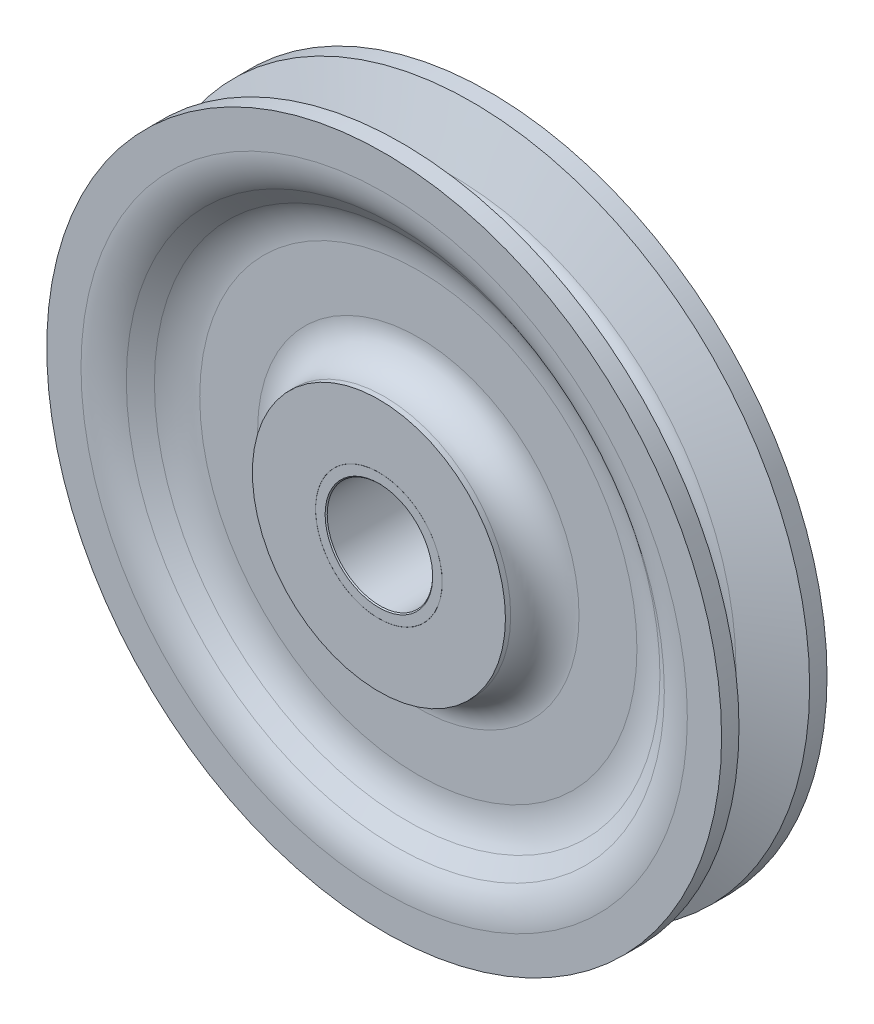
ISO-10303-21;
HEADER;
FILE_DESCRIPTION(('STEP AP214'),'2;1');
FILE_NAME('part.step','',(''),(''),'','','');
FILE_SCHEMA(('AUTOMOTIVE_DESIGN { 1 0 10303 214 1 1 1 1 }'));
ENDSEC;
DATA;
#1=APPLICATION_CONTEXT('core data for automotive mechanical design processes');
#2=APPLICATION_PROTOCOL_DEFINITION('international standard','automotive_design',2000,#1);
#3=PRODUCT_CONTEXT('',#1,'mechanical');
#4=PRODUCT('Part','Part','',(#3));
#5=PRODUCT_RELATED_PRODUCT_CATEGORY('part','',(#4));
#6=PRODUCT_DEFINITION_FORMATION('','',#4);
#7=PRODUCT_DEFINITION_CONTEXT('part definition',#1,'design');
#8=PRODUCT_DEFINITION('design','',#6,#7);
#9=PRODUCT_DEFINITION_SHAPE('','',#8);
#10=(LENGTH_UNIT() NAMED_UNIT(*) SI_UNIT(.MILLI.,.METRE.));
#11=(NAMED_UNIT(*) PLANE_ANGLE_UNIT() SI_UNIT($,.RADIAN.));
#12=(NAMED_UNIT(*) SI_UNIT($,.STERADIAN.) SOLID_ANGLE_UNIT());
#13=UNCERTAINTY_MEASURE_WITH_UNIT(LENGTH_MEASURE(1.E-05),#10,'distance_accuracy_value','');
#14=(GEOMETRIC_REPRESENTATION_CONTEXT(3) GLOBAL_UNCERTAINTY_ASSIGNED_CONTEXT((#13)) GLOBAL_UNIT_ASSIGNED_CONTEXT((#10,
#11,#12)) REPRESENTATION_CONTEXT('',''));
#15=CARTESIAN_POINT('',(0.,0.,0.));
#16=DIRECTION('',(0.,0.,1.));
#17=DIRECTION('',(1.,0.,0.));
#18=AXIS2_PLACEMENT_3D('',#15,#16,#17);
#19=CARTESIAN_POINT('',(0.,0.,0.));
#20=DIRECTION('',(0.,0.,1.));
#21=DIRECTION('',(1.,0.,0.));
#22=AXIS2_PLACEMENT_3D('',#19,#20,#21);
#23=TOROIDAL_SURFACE('',#22,87.3125,4.7625);
#24=CARTESIAN_POINT('',(0.,0.,4.44147333552489));
#25=DIRECTION('',(0.,0.,1.));
#26=DIRECTION('',(1.,0.,0.));
#27=AXIS2_PLACEMENT_3D('',#24,#25,#26);
#28=CIRCLE('',#27,85.5935698502203);
#29=CARTESIAN_POINT('',(85.5935698502203,0.,4.44147333552489));
#30=VERTEX_POINT('',#29);
#31=EDGE_CURVE('E132',#30,#30,#28,.T.);
#32=ORIENTED_EDGE('',*,*,#31,.F.);
#33=EDGE_LOOP('',(#32));
#34=FACE_BOUND('',#33,.T.);
#35=CARTESIAN_POINT('',(0.,0.,-4.44147333552489));
#36=DIRECTION('',(0.,0.,1.));
#37=DIRECTION('',(1.,0.,0.));
#38=AXIS2_PLACEMENT_3D('',#35,#36,#37);
#39=CIRCLE('',#38,85.5935698502204);
#40=CARTESIAN_POINT('',(85.5935698502204,0.,-4.44147333552489));
#41=VERTEX_POINT('',#40);
#42=EDGE_CURVE('E128',#41,#41,#39,.T.);
#43=ORIENTED_EDGE('',*,*,#42,.T.);
#44=EDGE_LOOP('',(#43));
#45=FACE_BOUND('',#44,.T.);
#46=ADVANCED_FACE('F59',(#34,#45),#23,.F.);
#47=CARTESIAN_POINT('',(0.,0.,4.44147333552489));
#48=DIRECTION('',(0.,0.,1.));
#49=DIRECTION('',(1.,0.,0.));
#50=AXIS2_PLACEMENT_3D('',#47,#48,#49);
#51=CONICAL_SURFACE('',#50,85.5935698502203,1.20153117514669);
#52=CARTESIAN_POINT('',(0.,0.,10.63625));
#53=DIRECTION('',(0.,0.,1.));
#54=DIRECTION('',(1.,0.,0.));
#55=AXIS2_PLACEMENT_3D('',#52,#53,#54);
#56=CIRCLE('',#55,101.6);
#57=CARTESIAN_POINT('',(101.6,0.,10.63625));
#58=VERTEX_POINT('',#57);
#59=EDGE_CURVE('E150',#58,#58,#56,.T.);
#60=ORIENTED_EDGE('',*,*,#59,.F.);
#61=EDGE_LOOP('',(#60));
#62=FACE_BOUND('',#61,.T.);
#63=ORIENTED_EDGE('',*,*,#31,.T.);
#64=EDGE_LOOP('',(#63));
#65=FACE_BOUND('',#64,.T.);
#66=ADVANCED_FACE('F159',(#62,#65),#51,.T.);
#67=CARTESIAN_POINT('',(0.,0.,17.4625));
#68=DIRECTION('',(0.,0.,1.));
#69=DIRECTION('',(1.,0.,0.));
#70=AXIS2_PLACEMENT_3D('',#67,#68,#69);
#71=CYLINDRICAL_SURFACE('',#70,101.6);
#72=CARTESIAN_POINT('',(0.,0.,15.875));
#73=DIRECTION('',(0.,0.,1.));
#74=DIRECTION('',(1.,0.,0.));
#75=AXIS2_PLACEMENT_3D('',#72,#73,#74);
#76=CIRCLE('',#75,101.6);
#77=CARTESIAN_POINT('',(101.6,0.,15.875));
#78=VERTEX_POINT('',#77);
#79=EDGE_CURVE('E146',#78,#78,#76,.T.);
#80=ORIENTED_EDGE('',*,*,#79,.F.);
#81=EDGE_LOOP('',(#80));
#82=FACE_BOUND('',#81,.T.);
#83=ORIENTED_EDGE('',*,*,#59,.T.);
#84=EDGE_LOOP('',(#83));
#85=FACE_BOUND('',#84,.T.);
#86=ADVANCED_FACE('F254',(#82,#85),#71,.T.);
#87=CARTESIAN_POINT('',(0.,38.1,15.875));
#88=DIRECTION('',(0.,0.,-1.));
#89=DIRECTION('',(-1.,0.,0.));
#90=AXIS2_PLACEMENT_3D('',#87,#88,#89);
#91=PLANE('',#90);
#92=CARTESIAN_POINT('',(0.,0.,15.875));
#93=DIRECTION('',(0.,0.,-1.));
#94=DIRECTION('',(-1.,0.,0.));
#95=AXIS2_PLACEMENT_3D('',#92,#93,#94);
#96=CIRCLE('',#95,91.2848770431011);
#97=CARTESIAN_POINT('',(-91.2848770431011,0.,15.875));
#98=VERTEX_POINT('',#97);
#99=EDGE_CURVE('E85',#98,#98,#96,.T.);
#100=ORIENTED_EDGE('',*,*,#99,.T.);
#101=EDGE_LOOP('',(#100));
#102=FACE_BOUND('',#101,.T.);
#103=ORIENTED_EDGE('',*,*,#79,.T.);
#104=EDGE_LOOP('',(#103));
#105=FACE_BOUND('',#104,.T.);
#106=ADVANCED_FACE('F258',(#102,#105),#91,.F.);
#107=CARTESIAN_POINT('',(0.,0.,17.4625));
#108=DIRECTION('',(0.,0.,1.));
#109=DIRECTION('',(1.,0.,0.));
#110=AXIS2_PLACEMENT_3D('',#107,#108,#109);
#111=CYLINDRICAL_SURFACE('',#110,38.1);
#112=CARTESIAN_POINT('',(0.,0.,15.875));
#113=DIRECTION('',(0.,0.,-1.));
#114=DIRECTION('',(-1.,0.,0.));
#115=AXIS2_PLACEMENT_3D('',#112,#113,#114);
#116=CIRCLE('',#115,38.1);
#117=CARTESIAN_POINT('',(-38.1,0.,15.875));
#118=VERTEX_POINT('',#117);
#119=EDGE_CURVE('E12',#118,#118,#116,.F.);
#120=ORIENTED_EDGE('',*,*,#119,.T.);
#121=EDGE_LOOP('',(#120));
#122=FACE_BOUND('',#121,.T.);
#123=CARTESIAN_POINT('',(0.,0.,17.4625));
#124=DIRECTION('',(0.,0.,1.));
#125=DIRECTION('',(1.,0.,0.));
#126=AXIS2_PLACEMENT_3D('',#123,#124,#125);
#127=CIRCLE('',#126,38.1);
#128=CARTESIAN_POINT('',(38.1,0.,17.4625));
#129=VERTEX_POINT('',#128);
#130=EDGE_CURVE('E127',#129,#129,#127,.T.);
#131=ORIENTED_EDGE('',*,*,#130,.F.);
#132=EDGE_LOOP('',(#131));
#133=FACE_BOUND('',#132,.T.);
#134=ADVANCED_FACE('F199',(#122,#133),#111,.T.);
#135=CARTESIAN_POINT('',(0.,19.05,17.4625));
#136=DIRECTION('',(0.,0.,-1.));
#137=DIRECTION('',(-1.,0.,0.));
#138=AXIS2_PLACEMENT_3D('',#135,#136,#137);
#139=PLANE('',#138);
#140=CARTESIAN_POINT('',(0.,0.,17.4625));
#141=DIRECTION('',(0.,0.,1.));
#142=DIRECTION('',(1.,0.,0.));
#143=AXIS2_PLACEMENT_3D('',#140,#141,#142);
#144=CIRCLE('',#143,19.0754);
#145=CARTESIAN_POINT('',(19.0754,0.,17.4625));
#146=VERTEX_POINT('',#145);
#147=EDGE_CURVE('E117',#146,#146,#144,.T.);
#148=ORIENTED_EDGE('',*,*,#147,.F.);
#149=EDGE_LOOP('',(#148));
#150=FACE_BOUND('',#149,.T.);
#151=ORIENTED_EDGE('',*,*,#130,.T.);
#152=EDGE_LOOP('',(#151));
#153=FACE_BOUND('',#152,.T.);
#154=ADVANCED_FACE('F196',(#150,#153),#139,.F.);
#155=CARTESIAN_POINT('',(0.,38.1,-17.4625));
#156=DIRECTION('',(0.,0.,1.));
#157=DIRECTION('',(1.,0.,0.));
#158=AXIS2_PLACEMENT_3D('',#155,#156,#157);
#159=PLANE('',#158);
#160=CARTESIAN_POINT('',(0.,0.,-17.4625));
#161=DIRECTION('',(0.,0.,1.));
#162=DIRECTION('',(1.,0.,0.));
#163=AXIS2_PLACEMENT_3D('',#160,#161,#162);
#164=CIRCLE('',#163,19.0754);
#165=CARTESIAN_POINT('',(19.0754,0.,-17.4625));
#166=VERTEX_POINT('',#165);
#167=EDGE_CURVE('E122',#166,#166,#164,.T.);
#168=ORIENTED_EDGE('',*,*,#167,.T.);
#169=EDGE_LOOP('',(#168));
#170=FACE_BOUND('',#169,.T.);
#171=CARTESIAN_POINT('',(0.,0.,-17.4625));
#172=DIRECTION('',(0.,0.,1.));
#173=DIRECTION('',(1.,0.,0.));
#174=AXIS2_PLACEMENT_3D('',#171,#172,#173);
#175=CIRCLE('',#174,38.1);
#176=CARTESIAN_POINT('',(38.1,0.,-17.4625));
#177=VERTEX_POINT('',#176);
#178=EDGE_CURVE('E126',#177,#177,#175,.T.);
#179=ORIENTED_EDGE('',*,*,#178,.F.);
#180=EDGE_LOOP('',(#179));
#181=FACE_BOUND('',#180,.T.);
#182=ADVANCED_FACE('F187',(#170,#181),#159,.F.);
#183=CARTESIAN_POINT('',(0.,0.,17.4625));
#184=DIRECTION('',(0.,0.,1.));
#185=DIRECTION('',(1.,0.,0.));
#186=AXIS2_PLACEMENT_3D('',#183,#184,#185);
#187=CYLINDRICAL_SURFACE('',#186,38.1);
#188=CARTESIAN_POINT('',(0.,0.,-15.875));
#189=DIRECTION('',(0.,0.,1.));
#190=DIRECTION('',(1.,0.,0.));
#191=AXIS2_PLACEMENT_3D('',#188,#189,#190);
#192=CIRCLE('',#191,38.1);
#193=CARTESIAN_POINT('',(38.1,0.,-15.875));
#194=VERTEX_POINT('',#193);
#195=EDGE_CURVE('E79',#194,#194,#192,.F.);
#196=ORIENTED_EDGE('',*,*,#195,.T.);
#197=EDGE_LOOP('',(#196));
#198=FACE_BOUND('',#197,.T.);
#199=ORIENTED_EDGE('',*,*,#178,.T.);
#200=EDGE_LOOP('',(#199));
#201=FACE_BOUND('',#200,.T.);
#202=ADVANCED_FACE('F181',(#198,#201),#187,.T.);
#203=CARTESIAN_POINT('',(0.,101.6,-15.875));
#204=DIRECTION('',(0.,0.,1.));
#205=DIRECTION('',(1.,0.,0.));
#206=AXIS2_PLACEMENT_3D('',#203,#204,#205);
#207=PLANE('',#206);
#208=CARTESIAN_POINT('',(0.,0.,-15.875));
#209=DIRECTION('',(0.,0.,1.));
#210=DIRECTION('',(1.,0.,0.));
#211=AXIS2_PLACEMENT_3D('',#208,#209,#210);
#212=CIRCLE('',#211,91.2848770431011);
#213=CARTESIAN_POINT('',(91.2848770431011,0.,-15.875));
#214=VERTEX_POINT('',#213);
#215=EDGE_CURVE('E101',#214,#214,#212,.T.);
#216=ORIENTED_EDGE('',*,*,#215,.T.);
#217=EDGE_LOOP('',(#216));
#218=FACE_BOUND('',#217,.T.);
#219=CARTESIAN_POINT('',(0.,0.,-15.875));
#220=DIRECTION('',(0.,0.,1.));
#221=DIRECTION('',(1.,0.,0.));
#222=AXIS2_PLACEMENT_3D('',#219,#220,#221);
#223=CIRCLE('',#222,101.6);
#224=CARTESIAN_POINT('',(101.6,0.,-15.875));
#225=VERTEX_POINT('',#224);
#226=EDGE_CURVE('E136',#225,#225,#223,.T.);
#227=ORIENTED_EDGE('',*,*,#226,.F.);
#228=EDGE_LOOP('',(#227));
#229=FACE_BOUND('',#228,.T.);
#230=ADVANCED_FACE('F176',(#218,#229),#207,.F.);
#231=CARTESIAN_POINT('',(0.,0.,17.4625));
#232=DIRECTION('',(0.,0.,1.));
#233=DIRECTION('',(1.,0.,0.));
#234=AXIS2_PLACEMENT_3D('',#231,#232,#233);
#235=CYLINDRICAL_SURFACE('',#234,101.6);
#236=CARTESIAN_POINT('',(0.,0.,-10.63625));
#237=DIRECTION('',(0.,0.,1.));
#238=DIRECTION('',(1.,0.,0.));
#239=AXIS2_PLACEMENT_3D('',#236,#237,#238);
#240=CIRCLE('',#239,101.6);
#241=CARTESIAN_POINT('',(101.6,0.,-10.63625));
#242=VERTEX_POINT('',#241);
#243=EDGE_CURVE('E121',#242,#242,#240,.T.);
#244=ORIENTED_EDGE('',*,*,#243,.F.);
#245=EDGE_LOOP('',(#244));
#246=FACE_BOUND('',#245,.T.);
#247=ORIENTED_EDGE('',*,*,#226,.T.);
#248=EDGE_LOOP('',(#247));
#249=FACE_BOUND('',#248,.T.);
#250=ADVANCED_FACE('F170',(#246,#249),#235,.T.);
#251=CARTESIAN_POINT('',(0.,0.,-10.63625));
#252=DIRECTION('',(0.,0.,-1.));
#253=DIRECTION('',(-1.,0.,0.));
#254=AXIS2_PLACEMENT_3D('',#251,#252,#253);
#255=CONICAL_SURFACE('',#254,101.6,1.20153117514669);
#256=ORIENTED_EDGE('',*,*,#42,.F.);
#257=EDGE_LOOP('',(#256));
#258=FACE_BOUND('',#257,.T.);
#259=ORIENTED_EDGE('',*,*,#243,.T.);
#260=EDGE_LOOP('',(#259));
#261=FACE_BOUND('',#260,.T.);
#262=ADVANCED_FACE('F166',(#258,#261),#255,.T.);
#263=CARTESIAN_POINT('',(0.,0.,-17.4625));
#264=DIRECTION('',(0.,0.,1.));
#265=DIRECTION('',(1.,0.,0.));
#266=AXIS2_PLACEMENT_3D('',#263,#264,#265);
#267=CYLINDRICAL_SURFACE('',#266,19.0754);
#268=CARTESIAN_POINT('',(19.0754,0.,-17.4625));
#269=CARTESIAN_POINT('',(19.0754,0.,-17.0986979166667));
#270=CARTESIAN_POINT('',(19.0754,0.,-16.7348958333333));
#271=CARTESIAN_POINT('',(19.0754,0.,-16.0072916666667));
#272=CARTESIAN_POINT('',(19.0754,0.,-15.6434895833333));
#273=CARTESIAN_POINT('',(19.0754,0.,-14.9158854166667));
#274=CARTESIAN_POINT('',(19.0754,0.,-14.5520833333333));
#275=CARTESIAN_POINT('',(19.0754,0.,-13.8244791666667));
#276=CARTESIAN_POINT('',(19.0754,0.,-13.4606770833333));
#277=CARTESIAN_POINT('',(19.0754,0.,-12.7330729166667));
#278=CARTESIAN_POINT('',(19.0754,0.,-12.3692708333333));
#279=CARTESIAN_POINT('',(19.0754,0.,-11.6416666666667));
#280=CARTESIAN_POINT('',(19.0754,0.,-11.2778645833333));
#281=CARTESIAN_POINT('',(19.0754,0.,-10.5502604166667));
#282=CARTESIAN_POINT('',(19.0754,0.,-10.1864583333333));
#283=CARTESIAN_POINT('',(19.0754,0.,-9.45885416666667));
#284=CARTESIAN_POINT('',(19.0754,0.,-9.09505208333334));
#285=CARTESIAN_POINT('',(19.0754,0.,-8.36744791666667));
#286=CARTESIAN_POINT('',(19.0754,0.,-8.00364583333334));
#287=CARTESIAN_POINT('',(19.0754,0.,-7.27604166666667));
#288=CARTESIAN_POINT('',(19.0754,0.,-6.91223958333334));
#289=CARTESIAN_POINT('',(19.0754,0.,-6.18463541666667));
#290=CARTESIAN_POINT('',(19.0754,0.,-5.82083333333334));
#291=CARTESIAN_POINT('',(19.0754,0.,-5.09322916666667));
#292=CARTESIAN_POINT('',(19.0754,0.,-4.72942708333334));
#293=CARTESIAN_POINT('',(19.0754,0.,-4.00182291666667));
#294=CARTESIAN_POINT('',(19.0754,0.,-3.63802083333334));
#295=CARTESIAN_POINT('',(19.0754,0.,-2.91041666666667));
#296=CARTESIAN_POINT('',(19.0754,0.,-2.54661458333334));
#297=CARTESIAN_POINT('',(19.0754,0.,-1.81901041666667));
#298=CARTESIAN_POINT('',(19.0754,0.,-1.45520833333334));
#299=CARTESIAN_POINT('',(19.0754,0.,-0.72760416666667));
#300=CARTESIAN_POINT('',(19.0754,0.,-0.363802083333337));
#301=CARTESIAN_POINT('',(19.0754,0.,0.36380208333333));
#302=CARTESIAN_POINT('',(19.0754,0.,0.727604166666663));
#303=CARTESIAN_POINT('',(19.0754,0.,1.45520833333333));
#304=CARTESIAN_POINT('',(19.0754,0.,1.81901041666666));
#305=CARTESIAN_POINT('',(19.0754,0.,2.54661458333333));
#306=CARTESIAN_POINT('',(19.0754,0.,2.91041666666666));
#307=CARTESIAN_POINT('',(19.0754,0.,3.63802083333333));
#308=CARTESIAN_POINT('',(19.0754,0.,4.00182291666667));
#309=CARTESIAN_POINT('',(19.0754,0.,4.72942708333333));
#310=CARTESIAN_POINT('',(19.0754,0.,5.09322916666666));
#311=CARTESIAN_POINT('',(19.0754,0.,5.82083333333333));
#312=CARTESIAN_POINT('',(19.0754,0.,6.18463541666667));
#313=CARTESIAN_POINT('',(19.0754,0.,6.91223958333333));
#314=CARTESIAN_POINT('',(19.0754,0.,7.27604166666667));
#315=CARTESIAN_POINT('',(19.0754,0.,8.00364583333333));
#316=CARTESIAN_POINT('',(19.0754,0.,8.36744791666667));
#317=CARTESIAN_POINT('',(19.0754,0.,9.09505208333333));
#318=CARTESIAN_POINT('',(19.0754,0.,9.45885416666667));
#319=CARTESIAN_POINT('',(19.0754,0.,10.1864583333333));
#320=CARTESIAN_POINT('',(19.0754,0.,10.5502604166667));
#321=CARTESIAN_POINT('',(19.0754,0.,11.2778645833333));
#322=CARTESIAN_POINT('',(19.0754,0.,11.6416666666667));
#323=CARTESIAN_POINT('',(19.0754,0.,12.3692708333333));
#324=CARTESIAN_POINT('',(19.0754,0.,12.7330729166667));
#325=CARTESIAN_POINT('',(19.0754,0.,13.4606770833333));
#326=CARTESIAN_POINT('',(19.0754,0.,13.8244791666667));
#327=CARTESIAN_POINT('',(19.0754,0.,14.5520833333333));
#328=CARTESIAN_POINT('',(19.0754,0.,14.9158854166667));
#329=CARTESIAN_POINT('',(19.0754,0.,15.6434895833333));
#330=CARTESIAN_POINT('',(19.0754,0.,16.0072916666667));
#331=CARTESIAN_POINT('',(19.0754,0.,16.7348958333333));
#332=CARTESIAN_POINT('',(19.0754,0.,17.0986979166667));
#333=CARTESIAN_POINT('',(19.0754,0.,17.4625));
#334=B_SPLINE_CURVE_WITH_KNOTS('',3,(#268,#269,#270,#271,#272,#273,#274,#275,#276,#277,#278,
#279,#280,#281,#282,#283,#284,#285,#286,#287,#288,#289,#290,#291,#292,#293,#294,#295,#296,#297,
#298,#299,#300,#301,#302,#303,#304,#305,#306,#307,#308,#309,#310,#311,#312,#313,#314,#315,#316,
#317,#318,#319,#320,#321,#322,#323,#324,#325,#326,#327,#328,#329,#330,#331,#332,#333),
.UNSPECIFIED.,.F.,.F.,(4,2,2,2,2,2,2,2,2,2,2,2,2,2,2,2,2,2,2,2,2,2,2,2,2,2,2,2,2,2,2,2,4),(0.,
1.09140625,2.1828125,3.27421875,4.365625,5.45703125,6.5484375,7.63984375,8.73125,9.82265625,
10.9140625,12.00546875,13.096875,14.18828125,15.2796875,16.37109375,17.4625,18.55390625,
19.6453125,20.73671875,21.828125,22.91953125,24.0109375,25.10234375,26.19375,27.28515625,
28.3765625,29.46796875,30.559375,31.65078125,32.7421875,33.83359375,34.925),.UNSPECIFIED.);
#335=EDGE_CURVE('BSEAM169',#166,#146,#334,.T.);
#336=ORIENTED_EDGE('',*,*,#167,.F.);
#337=ORIENTED_EDGE('',*,*,#147,.T.);
#338=ORIENTED_EDGE('',*,*,#335,.T.);
#339=ORIENTED_EDGE('',*,*,#335,.F.);
#340=EDGE_LOOP('',(#336,#338,#337,#339));
#341=FACE_BOUND('',#340,.T.);
#342=ADVANCED_FACE('F169',(#341),#267,.F.);
#343=CARTESIAN_POINT('',(0.,38.1,5.588));
#344=DIRECTION('',(0.,0.,-1.));
#345=DIRECTION('',(-1.,0.,0.));
#346=AXIS2_PLACEMENT_3D('',#343,#344,#345);
#347=PLANE('',#346);
#348=CARTESIAN_POINT('',(0.,0.,5.588));
#349=DIRECTION('',(0.,0.,-1.));
#350=DIRECTION('',(-1.,0.,0.));
#351=AXIS2_PLACEMENT_3D('',#348,#349,#350);
#352=CIRCLE('',#351,48.387);
#353=CARTESIAN_POINT('',(-48.387,0.,5.588));
#354=VERTEX_POINT('',#353);
#355=EDGE_CURVE('E67',#354,#354,#352,.T.);
#356=ORIENTED_EDGE('',*,*,#355,.T.);
#357=EDGE_LOOP('',(#356));
#358=FACE_BOUND('',#357,.T.);
#359=CARTESIAN_POINT('',(0.,0.,5.588));
#360=DIRECTION('',(0.,0.,-1.));
#361=DIRECTION('',(-1.,0.,0.));
#362=AXIS2_PLACEMENT_3D('',#359,#360,#361);
#363=CIRCLE('',#362,65.8201926816756);
#364=CARTESIAN_POINT('',(-65.8201926816756,0.,5.588));
#365=VERTEX_POINT('',#364);
#366=EDGE_CURVE('E89',#365,#365,#363,.F.);
#367=ORIENTED_EDGE('',*,*,#366,.T.);
#368=EDGE_LOOP('',(#367));
#369=FACE_BOUND('',#368,.T.);
#370=ADVANCED_FACE('F194',(#358,#369),#347,.F.);
#371=CARTESIAN_POINT('',(0.,0.,5.588));
#372=DIRECTION('',(0.,0.,1.));
#373=DIRECTION('',(1.,0.,0.));
#374=AXIS2_PLACEMENT_3D('',#371,#372,#373);
#375=CONICAL_SURFACE('',#374,71.5114998745564,0.939890250970642);
#376=CARTESIAN_POINT('',(0.,0.,8.94516922217653));
#377=DIRECTION('',(0.,0.,1.));
#378=DIRECTION('',(1.,0.,0.));
#379=AXIS2_PLACEMENT_3D('',#376,#377,#378);
#380=CIRCLE('',#379,76.1071926816757);
#381=CARTESIAN_POINT('',(76.1071926816757,0.,8.94516922217653));
#382=VERTEX_POINT('',#381);
#383=EDGE_CURVE('E93',#382,#382,#380,.F.);
#384=ORIENTED_EDGE('',*,*,#383,.T.);
#385=EDGE_LOOP('',(#384));
#386=FACE_BOUND('',#385,.T.);
#387=CARTESIAN_POINT('',(0.,0.,12.5178307778235));
#388=DIRECTION('',(0.,0.,-1.));
#389=DIRECTION('',(-1.,0.,0.));
#390=AXIS2_PLACEMENT_3D('',#387,#388,#389);
#391=CIRCLE('',#390,80.9978770431012);
#392=CARTESIAN_POINT('',(-80.9978770431012,0.,12.5178307778235));
#393=VERTEX_POINT('',#392);
#394=EDGE_CURVE('E97',#393,#393,#391,.F.);
#395=ORIENTED_EDGE('',*,*,#394,.T.);
#396=EDGE_LOOP('',(#395));
#397=FACE_BOUND('',#396,.T.);
#398=ADVANCED_FACE('F237',(#386,#397),#375,.F.);
#399=CARTESIAN_POINT('',(0.,38.1,-5.588));
#400=DIRECTION('',(0.,0.,1.));
#401=DIRECTION('',(-1.,0.,0.));
#402=AXIS2_PLACEMENT_3D('',#399,#400,#401);
#403=PLANE('',#402);
#404=CARTESIAN_POINT('',(0.,0.,-5.588));
#405=DIRECTION('',(0.,0.,1.));
#406=DIRECTION('',(1.,0.,0.));
#407=AXIS2_PLACEMENT_3D('',#404,#405,#406);
#408=CIRCLE('',#407,48.387);
#409=CARTESIAN_POINT('',(48.387,0.,-5.588));
#410=VERTEX_POINT('',#409);
#411=EDGE_CURVE('E73',#410,#410,#408,.T.);
#412=ORIENTED_EDGE('',*,*,#411,.T.);
#413=EDGE_LOOP('',(#412));
#414=FACE_BOUND('',#413,.T.);
#415=CARTESIAN_POINT('',(0.,0.,-5.588));
#416=DIRECTION('',(0.,0.,1.));
#417=DIRECTION('',(1.,0.,0.));
#418=AXIS2_PLACEMENT_3D('',#415,#416,#417);
#419=CIRCLE('',#418,65.8201926816756);
#420=CARTESIAN_POINT('',(65.8201926816756,0.,-5.588));
#421=VERTEX_POINT('',#420);
#422=EDGE_CURVE('E113',#421,#421,#419,.F.);
#423=ORIENTED_EDGE('',*,*,#422,.T.);
#424=EDGE_LOOP('',(#423));
#425=FACE_BOUND('',#424,.T.);
#426=ADVANCED_FACE('F234',(#414,#425),#403,.F.);
#427=CARTESIAN_POINT('',(0.,0.,-5.588));
#428=DIRECTION('',(0.,0.,-1.));
#429=DIRECTION('',(1.,0.,0.));
#430=AXIS2_PLACEMENT_3D('',#427,#428,#429);
#431=CONICAL_SURFACE('',#430,71.5114998745564,0.939890250970642);
#432=CARTESIAN_POINT('',(0.,0.,-8.94516922217653));
#433=DIRECTION('',(0.,0.,-1.));
#434=DIRECTION('',(-1.,0.,0.));
#435=AXIS2_PLACEMENT_3D('',#432,#433,#434);
#436=CIRCLE('',#435,76.1071926816757);
#437=CARTESIAN_POINT('',(-76.1071926816757,0.,-8.94516922217653));
#438=VERTEX_POINT('',#437);
#439=EDGE_CURVE('E105',#438,#438,#436,.F.);
#440=ORIENTED_EDGE('',*,*,#439,.T.);
#441=EDGE_LOOP('',(#440));
#442=FACE_BOUND('',#441,.T.);
#443=CARTESIAN_POINT('',(0.,0.,-12.5178307778235));
#444=DIRECTION('',(0.,0.,1.));
#445=DIRECTION('',(1.,0.,0.));
#446=AXIS2_PLACEMENT_3D('',#443,#444,#445);
#447=CIRCLE('',#446,80.9978770431012);
#448=CARTESIAN_POINT('',(80.9978770431012,0.,-12.5178307778235));
#449=VERTEX_POINT('',#448);
#450=EDGE_CURVE('E109',#449,#449,#447,.F.);
#451=ORIENTED_EDGE('',*,*,#450,.T.);
#452=EDGE_LOOP('',(#451));
#453=FACE_BOUND('',#452,.T.);
#454=ADVANCED_FACE('F208',(#442,#453),#431,.F.);
#455=CARTESIAN_POINT('',(0.,0.,-23.0272391978405));
#456=DIRECTION('',(0.,0.,1.));
#457=DIRECTION('',(1.,0.,0.));
#458=AXIS2_PLACEMENT_3D('',#455,#456,#457);
#459=TOROIDAL_SURFACE('',#458,65.8201926816756,17.4392391978405);
#460=ORIENTED_EDGE('',*,*,#439,.F.);
#461=EDGE_LOOP('',(#460));
#462=FACE_BOUND('',#461,.T.);
#463=ORIENTED_EDGE('',*,*,#422,.F.);
#464=EDGE_LOOP('',(#463));
#465=FACE_BOUND('',#464,.T.);
#466=ADVANCED_FACE('F204',(#462,#465),#459,.F.);
#467=CARTESIAN_POINT('',(0.,0.,1.56423919784046));
#468=DIRECTION('',(0.,0.,1.));
#469=DIRECTION('',(1.,0.,0.));
#470=AXIS2_PLACEMENT_3D('',#467,#468,#469);
#471=TOROIDAL_SURFACE('',#470,91.2848770431011,17.4392391978405);
#472=ORIENTED_EDGE('',*,*,#215,.F.);
#473=EDGE_LOOP('',(#472));
#474=FACE_BOUND('',#473,.T.);
#475=ORIENTED_EDGE('',*,*,#450,.F.);
#476=EDGE_LOOP('',(#475));
#477=FACE_BOUND('',#476,.T.);
#478=ADVANCED_FACE('F207',(#474,#477),#471,.T.);
#479=CARTESIAN_POINT('',(0.,0.,23.0272391978405));
#480=DIRECTION('',(0.,0.,-1.));
#481=DIRECTION('',(-1.,0.,0.));
#482=AXIS2_PLACEMENT_3D('',#479,#480,#481);
#483=TOROIDAL_SURFACE('',#482,65.8201926816756,17.4392391978405);
#484=ORIENTED_EDGE('',*,*,#366,.F.);
#485=EDGE_LOOP('',(#484));
#486=FACE_BOUND('',#485,.T.);
#487=ORIENTED_EDGE('',*,*,#383,.F.);
#488=EDGE_LOOP('',(#487));
#489=FACE_BOUND('',#488,.T.);
#490=ADVANCED_FACE('F212',(#486,#489),#483,.F.);
#491=CARTESIAN_POINT('',(0.,0.,-1.56423919784046));
#492=DIRECTION('',(0.,0.,-1.));
#493=DIRECTION('',(-1.,0.,0.));
#494=AXIS2_PLACEMENT_3D('',#491,#492,#493);
#495=TOROIDAL_SURFACE('',#494,91.2848770431011,17.4392391978405);
#496=ORIENTED_EDGE('',*,*,#394,.F.);
#497=EDGE_LOOP('',(#496));
#498=FACE_BOUND('',#497,.T.);
#499=ORIENTED_EDGE('',*,*,#99,.F.);
#500=EDGE_LOOP('',(#499));
#501=FACE_BOUND('',#500,.T.);
#502=ADVANCED_FACE('F216',(#498,#501),#495,.T.);
#503=CARTESIAN_POINT('',(0.,0.,-15.875));
#504=DIRECTION('',(0.,0.,1.));
#505=DIRECTION('',(1.,0.,0.));
#506=AXIS2_PLACEMENT_3D('',#503,#504,#505);
#507=TOROIDAL_SURFACE('',#506,48.387,10.287);
#508=ORIENTED_EDGE('',*,*,#411,.F.);
#509=EDGE_LOOP('',(#508));
#510=FACE_BOUND('',#509,.T.);
#511=ORIENTED_EDGE('',*,*,#195,.F.);
#512=EDGE_LOOP('',(#511));
#513=FACE_BOUND('',#512,.T.);
#514=ADVANCED_FACE('F219',(#510,#513),#507,.F.);
#515=CARTESIAN_POINT('',(0.,0.,15.875));
#516=DIRECTION('',(0.,0.,-1.));
#517=DIRECTION('',(-1.,0.,0.));
#518=AXIS2_PLACEMENT_3D('',#515,#516,#517);
#519=TOROIDAL_SURFACE('',#518,48.387,10.287);
#520=ORIENTED_EDGE('',*,*,#119,.F.);
#521=EDGE_LOOP('',(#520));
#522=FACE_BOUND('',#521,.T.);
#523=ORIENTED_EDGE('',*,*,#355,.F.);
#524=EDGE_LOOP('',(#523));
#525=FACE_BOUND('',#524,.T.);
#526=ADVANCED_FACE('F61',(#522,#525),#519,.F.);
#527=CLOSED_SHELL('',(#46,#66,#86,#106,#134,#154,#182,#202,#230,#250,#262,#342,#370,#398,#426,
#454,#466,#478,#490,#502,#514,#526));
#528=MANIFOLD_SOLID_BREP('B2',#527);
#529=CARTESIAN_POINT('',(0.,19.05,17.4625));
#530=DIRECTION('',(0.,0.,-1.));
#531=DIRECTION('',(-1.,0.,0.));
#532=AXIS2_PLACEMENT_3D('',#529,#530,#531);
#533=PLANE('',#532);
#534=CARTESIAN_POINT('',(0.,0.,17.4625));
#535=DIRECTION('',(0.,0.,-1.));
#536=DIRECTION('',(-1.,0.,0.));
#537=AXIS2_PLACEMENT_3D('',#534,#535,#536);
#538=CIRCLE('',#537,16.1925);
#539=CARTESIAN_POINT('',(-16.1925,0.,17.4625));
#540=VERTEX_POINT('',#539);
#541=EDGE_CURVE('E58',#540,#540,#538,.T.);
#542=ORIENTED_EDGE('',*,*,#541,.T.);
#543=EDGE_LOOP('',(#542));
#544=FACE_BOUND('',#543,.T.);
#545=CARTESIAN_POINT('',(0.,0.,17.4625));
#546=DIRECTION('',(0.,0.,1.));
#547=DIRECTION('',(1.,0.,0.));
#548=AXIS2_PLACEMENT_3D('',#545,#546,#547);
#549=CIRCLE('',#548,19.05);
#550=CARTESIAN_POINT('',(19.05,0.,17.4625));
#551=VERTEX_POINT('',#550);
#552=EDGE_CURVE('E477',#551,#551,#549,.T.);
#553=ORIENTED_EDGE('',*,*,#552,.T.);
#554=EDGE_LOOP('',(#553));
#555=FACE_BOUND('',#554,.T.);
#556=ADVANCED_FACE('F447',(#544,#555),#533,.F.);
#557=CARTESIAN_POINT('',(0.,0.,17.4625));
#558=DIRECTION('',(0.,0.,1.));
#559=DIRECTION('',(1.,0.,0.));
#560=AXIS2_PLACEMENT_3D('',#557,#558,#559);
#561=CYLINDRICAL_SURFACE('',#560,15.875);
#562=CARTESIAN_POINT('',(0.,0.,-17.145));
#563=DIRECTION('',(0.,0.,1.));
#564=DIRECTION('',(1.,0.,0.));
#565=AXIS2_PLACEMENT_3D('',#562,#563,#564);
#566=CIRCLE('',#565,15.875);
#567=CARTESIAN_POINT('',(-15.875,0.,-17.145));
#568=VERTEX_POINT('',#567);
#569=EDGE_CURVE('E455',#568,#568,#566,.F.);
#570=ORIENTED_EDGE('',*,*,#569,.T.);
#571=EDGE_LOOP('',(#570));
#572=FACE_BOUND('',#571,.T.);
#573=CARTESIAN_POINT('',(0.,0.,17.145));
#574=DIRECTION('',(0.,0.,-1.));
#575=DIRECTION('',(-1.,0.,0.));
#576=AXIS2_PLACEMENT_3D('',#573,#574,#575);
#577=CIRCLE('',#576,15.875);
#578=CARTESIAN_POINT('',(-15.875,0.,17.145));
#579=VERTEX_POINT('',#578);
#580=EDGE_CURVE('E461',#579,#579,#577,.F.);
#581=ORIENTED_EDGE('',*,*,#580,.T.);
#582=EDGE_LOOP('',(#581));
#583=FACE_BOUND('',#582,.T.);
#584=ADVANCED_FACE('F495',(#572,#583),#561,.F.);
#585=CARTESIAN_POINT('',(0.,38.1,-17.4625));
#586=DIRECTION('',(0.,0.,1.));
#587=DIRECTION('',(1.,0.,0.));
#588=AXIS2_PLACEMENT_3D('',#585,#586,#587);
#589=PLANE('',#588);
#590=CARTESIAN_POINT('',(0.,0.,-17.4625));
#591=DIRECTION('',(0.,0.,1.));
#592=DIRECTION('',(1.,0.,0.));
#593=AXIS2_PLACEMENT_3D('',#590,#591,#592);
#594=CIRCLE('',#593,16.1925);
#595=CARTESIAN_POINT('',(-16.1925,0.,-17.4625));
#596=VERTEX_POINT('',#595);
#597=EDGE_CURVE('E467',#596,#596,#594,.T.);
#598=ORIENTED_EDGE('',*,*,#597,.T.);
#599=EDGE_LOOP('',(#598));
#600=FACE_BOUND('',#599,.T.);
#601=CARTESIAN_POINT('',(0.,0.,-17.4625));
#602=DIRECTION('',(0.,0.,1.));
#603=DIRECTION('',(1.,0.,0.));
#604=AXIS2_PLACEMENT_3D('',#601,#602,#603);
#605=CIRCLE('',#604,19.05);
#606=CARTESIAN_POINT('',(19.05,0.,-17.4625));
#607=VERTEX_POINT('',#606);
#608=EDGE_CURVE('E473',#607,#607,#605,.T.);
#609=ORIENTED_EDGE('',*,*,#608,.F.);
#610=EDGE_LOOP('',(#609));
#611=FACE_BOUND('',#610,.T.);
#612=ADVANCED_FACE('F487',(#600,#611),#589,.F.);
#613=CARTESIAN_POINT('',(0.,0.,-17.4625));
#614=DIRECTION('',(0.,0.,1.));
#615=DIRECTION('',(1.,0.,0.));
#616=AXIS2_PLACEMENT_3D('',#613,#614,#615);
#617=CYLINDRICAL_SURFACE('',#616,19.05);
#618=CARTESIAN_POINT('',(19.05,0.,-17.4625));
#619=CARTESIAN_POINT('',(19.05,0.,-17.0986979166667));
#620=CARTESIAN_POINT('',(19.05,0.,-16.7348958333333));
#621=CARTESIAN_POINT('',(19.05,0.,-16.0072916666667));
#622=CARTESIAN_POINT('',(19.05,0.,-15.6434895833333));
#623=CARTESIAN_POINT('',(19.05,0.,-14.9158854166667));
#624=CARTESIAN_POINT('',(19.05,0.,-14.5520833333333));
#625=CARTESIAN_POINT('',(19.05,0.,-13.8244791666667));
#626=CARTESIAN_POINT('',(19.05,0.,-13.4606770833333));
#627=CARTESIAN_POINT('',(19.05,0.,-12.7330729166667));
#628=CARTESIAN_POINT('',(19.05,0.,-12.3692708333333));
#629=CARTESIAN_POINT('',(19.05,0.,-11.6416666666667));
#630=CARTESIAN_POINT('',(19.05,0.,-11.2778645833333));
#631=CARTESIAN_POINT('',(19.05,0.,-10.5502604166667));
#632=CARTESIAN_POINT('',(19.05,0.,-10.1864583333333));
#633=CARTESIAN_POINT('',(19.05,0.,-9.45885416666667));
#634=CARTESIAN_POINT('',(19.05,0.,-9.09505208333334));
#635=CARTESIAN_POINT('',(19.05,0.,-8.36744791666667));
#636=CARTESIAN_POINT('',(19.05,0.,-8.00364583333334));
#637=CARTESIAN_POINT('',(19.05,0.,-7.27604166666667));
#638=CARTESIAN_POINT('',(19.05,0.,-6.91223958333334));
#639=CARTESIAN_POINT('',(19.05,0.,-6.18463541666667));
#640=CARTESIAN_POINT('',(19.05,0.,-5.82083333333334));
#641=CARTESIAN_POINT('',(19.05,0.,-5.09322916666667));
#642=CARTESIAN_POINT('',(19.05,0.,-4.72942708333334));
#643=CARTESIAN_POINT('',(19.05,0.,-4.00182291666667));
#644=CARTESIAN_POINT('',(19.05,0.,-3.63802083333334));
#645=CARTESIAN_POINT('',(19.05,0.,-2.91041666666667));
#646=CARTESIAN_POINT('',(19.05,0.,-2.54661458333334));
#647=CARTESIAN_POINT('',(19.05,0.,-1.81901041666667));
#648=CARTESIAN_POINT('',(19.05,0.,-1.45520833333334));
#649=CARTESIAN_POINT('',(19.05,0.,-0.727604166666673));
#650=CARTESIAN_POINT('',(19.05,0.,-0.36380208333334));
#651=CARTESIAN_POINT('',(19.05,0.,0.363802083333326));
#652=CARTESIAN_POINT('',(19.05,0.,0.727604166666659));
#653=CARTESIAN_POINT('',(19.05,0.,1.45520833333333));
#654=CARTESIAN_POINT('',(19.05,0.,1.81901041666666));
#655=CARTESIAN_POINT('',(19.05,0.,2.54661458333333));
#656=CARTESIAN_POINT('',(19.05,0.,2.91041666666666));
#657=CARTESIAN_POINT('',(19.05,0.,3.63802083333333));
#658=CARTESIAN_POINT('',(19.05,0.,4.00182291666666));
#659=CARTESIAN_POINT('',(19.05,0.,4.72942708333333));
#660=CARTESIAN_POINT('',(19.05,0.,5.09322916666666));
#661=CARTESIAN_POINT('',(19.05,0.,5.82083333333333));
#662=CARTESIAN_POINT('',(19.05,0.,6.18463541666666));
#663=CARTESIAN_POINT('',(19.05,0.,6.91223958333333));
#664=CARTESIAN_POINT('',(19.05,0.,7.27604166666666));
#665=CARTESIAN_POINT('',(19.05,0.,8.00364583333333));
#666=CARTESIAN_POINT('',(19.05,0.,8.36744791666666));
#667=CARTESIAN_POINT('',(19.05,0.,9.09505208333333));
#668=CARTESIAN_POINT('',(19.05,0.,9.45885416666666));
#669=CARTESIAN_POINT('',(19.05,0.,10.1864583333333));
#670=CARTESIAN_POINT('',(19.05,0.,10.5502604166667));
#671=CARTESIAN_POINT('',(19.05,0.,11.2778645833333));
#672=CARTESIAN_POINT('',(19.05,0.,11.6416666666667));
#673=CARTESIAN_POINT('',(19.05,0.,12.3692708333333));
#674=CARTESIAN_POINT('',(19.05,0.,12.7330729166667));
#675=CARTESIAN_POINT('',(19.05,0.,13.4606770833333));
#676=CARTESIAN_POINT('',(19.05,0.,13.8244791666667));
#677=CARTESIAN_POINT('',(19.05,0.,14.5520833333333));
#678=CARTESIAN_POINT('',(19.05,0.,14.9158854166667));
#679=CARTESIAN_POINT('',(19.05,0.,15.6434895833333));
#680=CARTESIAN_POINT('',(19.05,0.,16.0072916666667));
#681=CARTESIAN_POINT('',(19.05,0.,16.7348958333333));
#682=CARTESIAN_POINT('',(19.05,0.,17.0986979166667));
#683=CARTESIAN_POINT('',(19.05,0.,17.4625));
#684=B_SPLINE_CURVE_WITH_KNOTS('',3,(#618,#619,#620,#621,#622,#623,#624,#625,#626,#627,#628,
#629,#630,#631,#632,#633,#634,#635,#636,#637,#638,#639,#640,#641,#642,#643,#644,#645,#646,#647,
#648,#649,#650,#651,#652,#653,#654,#655,#656,#657,#658,#659,#660,#661,#662,#663,#664,#665,#666,
#667,#668,#669,#670,#671,#672,#673,#674,#675,#676,#677,#678,#679,#680,#681,#682,#683),
.UNSPECIFIED.,.F.,.F.,(4,2,2,2,2,2,2,2,2,2,2,2,2,2,2,2,2,2,2,2,2,2,2,2,2,2,2,2,2,2,2,2,4),(0.,
1.09140625,2.1828125,3.27421875,4.365625,5.45703125,6.5484375,7.63984375,8.73125,9.82265625,
10.9140625,12.00546875,13.096875,14.18828125,15.2796875,16.37109375,17.4625,18.55390625,
19.6453125,20.73671875,21.828125,22.91953125,24.0109375,25.10234375,26.19375,27.28515625,
28.3765625,29.46796875,30.559375,31.65078125,32.7421875,33.83359375,34.925),.UNSPECIFIED.);
#685=EDGE_CURVE('BSEAM484',#607,#551,#684,.T.);
#686=ORIENTED_EDGE('',*,*,#608,.T.);
#687=ORIENTED_EDGE('',*,*,#552,.F.);
#688=ORIENTED_EDGE('',*,*,#685,.T.);
#689=ORIENTED_EDGE('',*,*,#685,.F.);
#690=EDGE_LOOP('',(#686,#688,#687,#689));
#691=FACE_BOUND('',#690,.T.);
#692=ADVANCED_FACE('F484',(#691),#617,.T.);
#693=CARTESIAN_POINT('',(0.,0.,-17.4625));
#694=DIRECTION('',(0.,0.,-1.));
#695=DIRECTION('',(-1.,0.,0.));
#696=AXIS2_PLACEMENT_3D('',#693,#694,#695);
#697=CONICAL_SURFACE('',#696,16.1925,0.785398163397454);
#698=CARTESIAN_POINT('',(-15.875,0.,-17.145));
#699=CARTESIAN_POINT('',(-15.8783072916667,0.,-17.1483072916667));
#700=CARTESIAN_POINT('',(-15.8816145833333,0.,-17.1516145833333));
#701=CARTESIAN_POINT('',(-15.8882291666667,0.,-17.1582291666667));
#702=CARTESIAN_POINT('',(-15.8915364583333,0.,-17.1615364583333));
#703=CARTESIAN_POINT('',(-15.8981510416667,0.,-17.1681510416667));
#704=CARTESIAN_POINT('',(-15.9014583333333,0.,-17.1714583333333));
#705=CARTESIAN_POINT('',(-15.9080729166667,0.,-17.1780729166667));
#706=CARTESIAN_POINT('',(-15.9113802083333,0.,-17.1813802083333));
#707=CARTESIAN_POINT('',(-15.9179947916667,0.,-17.1879947916667));
#708=CARTESIAN_POINT('',(-15.9213020833333,0.,-17.1913020833333));
#709=CARTESIAN_POINT('',(-15.9279166666667,0.,-17.1979166666667));
#710=CARTESIAN_POINT('',(-15.9312239583333,0.,-17.2012239583333));
#711=CARTESIAN_POINT('',(-15.9378385416667,0.,-17.2078385416667));
#712=CARTESIAN_POINT('',(-15.9411458333333,0.,-17.2111458333333));
#713=CARTESIAN_POINT('',(-15.9477604166667,0.,-17.2177604166667));
#714=CARTESIAN_POINT('',(-15.9510677083333,0.,-17.2210677083333));
#715=CARTESIAN_POINT('',(-15.9576822916667,0.,-17.2276822916667));
#716=CARTESIAN_POINT('',(-15.9609895833333,0.,-17.2309895833333));
#717=CARTESIAN_POINT('',(-15.9676041666667,0.,-17.2376041666667));
#718=CARTESIAN_POINT('',(-15.9709114583333,0.,-17.2409114583333));
#719=CARTESIAN_POINT('',(-15.9775260416667,0.,-17.2475260416667));
#720=CARTESIAN_POINT('',(-15.9808333333333,0.,-17.2508333333333));
#721=CARTESIAN_POINT('',(-15.9874479166667,0.,-17.2574479166667));
#722=CARTESIAN_POINT('',(-15.9907552083333,0.,-17.2607552083333));
#723=CARTESIAN_POINT('',(-15.9973697916667,0.,-17.2673697916667));
#724=CARTESIAN_POINT('',(-16.0006770833333,0.,-17.2706770833333));
#725=CARTESIAN_POINT('',(-16.0072916666667,0.,-17.2772916666667));
#726=CARTESIAN_POINT('',(-16.0105989583333,0.,-17.2805989583333));
#727=CARTESIAN_POINT('',(-16.0172135416667,0.,-17.2872135416667));
#728=CARTESIAN_POINT('',(-16.0205208333333,0.,-17.2905208333333));
#729=CARTESIAN_POINT('',(-16.0271354166667,0.,-17.2971354166667));
#730=CARTESIAN_POINT('',(-16.0304427083333,0.,-17.3004427083333));
#731=CARTESIAN_POINT('',(-16.0370572916667,0.,-17.3070572916667));
#732=CARTESIAN_POINT('',(-16.0403645833333,0.,-17.3103645833333));
#733=CARTESIAN_POINT('',(-16.0469791666667,0.,-17.3169791666667));
#734=CARTESIAN_POINT('',(-16.0502864583333,0.,-17.3202864583333));
#735=CARTESIAN_POINT('',(-16.0569010416667,0.,-17.3269010416667));
#736=CARTESIAN_POINT('',(-16.0602083333333,0.,-17.3302083333333));
#737=CARTESIAN_POINT('',(-16.0668229166667,0.,-17.3368229166667));
#738=CARTESIAN_POINT('',(-16.0701302083333,0.,-17.3401302083333));
#739=CARTESIAN_POINT('',(-16.0767447916667,0.,-17.3467447916667));
#740=CARTESIAN_POINT('',(-16.0800520833333,0.,-17.3500520833333));
#741=CARTESIAN_POINT('',(-16.0866666666667,0.,-17.3566666666667));
#742=CARTESIAN_POINT('',(-16.0899739583333,0.,-17.3599739583333));
#743=CARTESIAN_POINT('',(-16.0965885416667,0.,-17.3665885416667));
#744=CARTESIAN_POINT('',(-16.0998958333333,0.,-17.3698958333333));
#745=CARTESIAN_POINT('',(-16.1065104166667,0.,-17.3765104166667));
#746=CARTESIAN_POINT('',(-16.1098177083333,0.,-17.3798177083333));
#747=CARTESIAN_POINT('',(-16.1164322916667,0.,-17.3864322916667));
#748=CARTESIAN_POINT('',(-16.1197395833333,0.,-17.3897395833333));
#749=CARTESIAN_POINT('',(-16.1263541666667,0.,-17.3963541666667));
#750=CARTESIAN_POINT('',(-16.1296614583333,0.,-17.3996614583333));
#751=CARTESIAN_POINT('',(-16.1362760416667,0.,-17.4062760416667));
#752=CARTESIAN_POINT('',(-16.1395833333333,0.,-17.4095833333333));
#753=CARTESIAN_POINT('',(-16.1461979166667,0.,-17.4161979166667));
#754=CARTESIAN_POINT('',(-16.1495052083333,0.,-17.4195052083333));
#755=CARTESIAN_POINT('',(-16.1561197916667,0.,-17.4261197916667));
#756=CARTESIAN_POINT('',(-16.1594270833333,0.,-17.4294270833333));
#757=CARTESIAN_POINT('',(-16.1660416666667,0.,-17.4360416666667));
#758=CARTESIAN_POINT('',(-16.1693489583333,0.,-17.4393489583333));
#759=CARTESIAN_POINT('',(-16.1759635416667,0.,-17.4459635416667));
#760=CARTESIAN_POINT('',(-16.1792708333333,0.,-17.4492708333333));
#761=CARTESIAN_POINT('',(-16.1858854166667,0.,-17.4558854166667));
#762=CARTESIAN_POINT('',(-16.1891927083333,0.,-17.4591927083333));
#763=CARTESIAN_POINT('',(-16.1925,0.,-17.4625));
#764=B_SPLINE_CURVE_WITH_KNOTS('',3,(#698,#699,#700,#701,#702,#703,#704,#705,#706,#707,#708,
#709,#710,#711,#712,#713,#714,#715,#716,#717,#718,#719,#720,#721,#722,#723,#724,#725,#726,#727,
#728,#729,#730,#731,#732,#733,#734,#735,#736,#737,#738,#739,#740,#741,#742,#743,#744,#745,#746,
#747,#748,#749,#750,#751,#752,#753,#754,#755,#756,#757,#758,#759,#760,#761,#762,#763),
.UNSPECIFIED.,.F.,.F.,(4,2,2,2,2,2,2,2,2,2,2,2,2,2,2,2,2,2,2,2,2,2,2,2,2,2,2,2,2,2,2,2,4),(0.,
0.0140316501891693,0.0280633003783385,0.0420949505675078,0.056126600756677,0.0701582509458487,
0.0841899011350204,0.0982215513241897,0.112253201513359,0.126284851702528,0.1403165018917,
0.154348152080872,0.168379802270041,0.18241145245921,0.196443102648382,0.210474752837551,
0.224506403026723,0.238538053215892,0.252569703405061,0.266601353594233,0.280633003783402,
0.294664653972571,0.308696304161743,0.322727954350915,0.336759604540084,0.350791254729253,
0.364822904918423,0.378854555107594,0.392886205296766,0.406917855485935,0.420949505675104,
0.434981155864274,0.449012806053445),.UNSPECIFIED.);
#765=EDGE_CURVE('BSEAM486',#568,#596,#764,.T.);
#766=ORIENTED_EDGE('',*,*,#569,.F.);
#767=ORIENTED_EDGE('',*,*,#597,.F.);
#768=ORIENTED_EDGE('',*,*,#765,.T.);
#769=ORIENTED_EDGE('',*,*,#765,.F.);
#770=EDGE_LOOP('',(#766,#768,#767,#769));
#771=FACE_BOUND('',#770,.T.);
#772=ADVANCED_FACE('F486',(#771),#697,.F.);
#773=CARTESIAN_POINT('',(0.,0.,17.145));
#774=DIRECTION('',(0.,0.,1.));
#775=DIRECTION('',(1.,0.,0.));
#776=AXIS2_PLACEMENT_3D('',#773,#774,#775);
#777=CONICAL_SURFACE('',#776,15.875,0.785398163397459);
#778=ORIENTED_EDGE('',*,*,#541,.F.);
#779=EDGE_LOOP('',(#778));
#780=FACE_BOUND('',#779,.T.);
#781=ORIENTED_EDGE('',*,*,#580,.F.);
#782=EDGE_LOOP('',(#781));
#783=FACE_BOUND('',#782,.T.);
#784=ADVANCED_FACE('F449',(#780,#783),#777,.F.);
#785=CLOSED_SHELL('',(#556,#584,#612,#692,#772,#784));
#786=MANIFOLD_SOLID_BREP('B7',#785);
#787=ADVANCED_BREP_SHAPE_REPRESENTATION('',(#18,#528,#786),#14);
#788=SHAPE_DEFINITION_REPRESENTATION(#9,#787);
ENDSEC;
END-ISO-10303-21;
